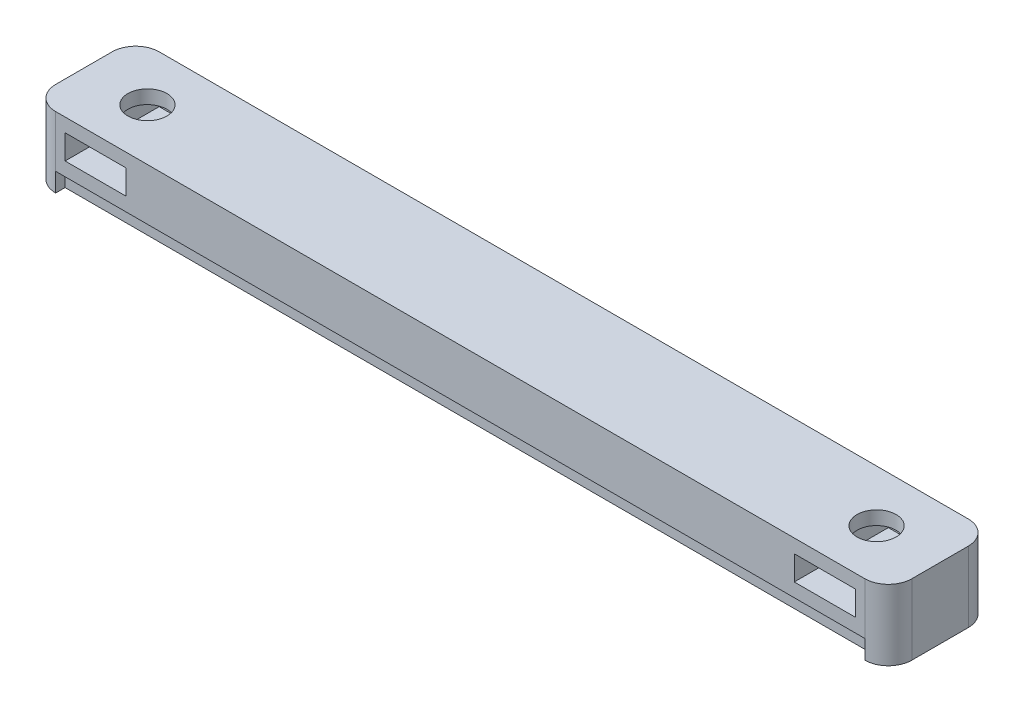
ISO-10303-21;
HEADER;
FILE_DESCRIPTION(('STEP AP214'),'2;1');
FILE_NAME('part.step','',(''),(''),'','','');
FILE_SCHEMA(('AUTOMOTIVE_DESIGN { 1 0 10303 214 1 1 1 1 }'));
ENDSEC;
DATA;
#1=APPLICATION_CONTEXT('core data for automotive mechanical design processes');
#2=APPLICATION_PROTOCOL_DEFINITION('international standard','automotive_design',2000,#1);
#3=PRODUCT_CONTEXT('',#1,'mechanical');
#4=PRODUCT('Part','Part','',(#3));
#5=PRODUCT_RELATED_PRODUCT_CATEGORY('part','',(#4));
#6=PRODUCT_DEFINITION_FORMATION('','',#4);
#7=PRODUCT_DEFINITION_CONTEXT('part definition',#1,'design');
#8=PRODUCT_DEFINITION('design','',#6,#7);
#9=PRODUCT_DEFINITION_SHAPE('','',#8);
#10=(LENGTH_UNIT() NAMED_UNIT(*) SI_UNIT(.MILLI.,.METRE.));
#11=(NAMED_UNIT(*) PLANE_ANGLE_UNIT() SI_UNIT($,.RADIAN.));
#12=(NAMED_UNIT(*) SI_UNIT($,.STERADIAN.) SOLID_ANGLE_UNIT());
#13=UNCERTAINTY_MEASURE_WITH_UNIT(LENGTH_MEASURE(1.E-05),#10,'distance_accuracy_value','');
#14=(GEOMETRIC_REPRESENTATION_CONTEXT(3) GLOBAL_UNCERTAINTY_ASSIGNED_CONTEXT((#13)) GLOBAL_UNIT_ASSIGNED_CONTEXT((#10,
#11,#12)) REPRESENTATION_CONTEXT('',''));
#15=CARTESIAN_POINT('',(0.,0.,0.));
#16=DIRECTION('',(0.,0.,1.));
#17=DIRECTION('',(1.,0.,0.));
#18=AXIS2_PLACEMENT_3D('',#15,#16,#17);
#19=CARTESIAN_POINT('',(0.,-32.,99.5));
#20=DIRECTION('',(0.,0.,-1.));
#21=DIRECTION('',(-1.,0.,0.));
#22=AXIS2_PLACEMENT_3D('',#19,#20,#21);
#23=PLANE('',#22);
#24=DIRECTION('',(0.,-1.,0.));
#25=VECTOR('',#24,1.);
#26=CARTESIAN_POINT('',(84.,-22.5,99.5));
#27=LINE('',#26,#25);
#28=CARTESIAN_POINT('',(84.,-19.9,99.5));
#29=VERTEX_POINT('',#28);
#30=CARTESIAN_POINT('',(84.,-25.1,99.5));
#31=VERTEX_POINT('',#30);
#32=EDGE_CURVE('E264',#29,#31,#27,.T.);
#33=ORIENTED_EDGE('',*,*,#32,.T.);
#34=DIRECTION('',(-1.,0.,0.));
#35=VECTOR('',#34,1.);
#36=CARTESIAN_POINT('',(77.5,-25.1,99.5));
#37=LINE('',#36,#35);
#38=CARTESIAN_POINT('',(71.,-25.1,99.5));
#39=VERTEX_POINT('',#38);
#40=EDGE_CURVE('E251',#31,#39,#37,.T.);
#41=ORIENTED_EDGE('',*,*,#40,.T.);
#42=DIRECTION('',(0.,-1.,0.));
#43=VECTOR('',#42,1.);
#44=CARTESIAN_POINT('',(71.,-22.5,99.5));
#45=LINE('',#44,#43);
#46=CARTESIAN_POINT('',(71.,-19.9,99.5));
#47=VERTEX_POINT('',#46);
#48=EDGE_CURVE('E51',#47,#39,#45,.T.);
#49=ORIENTED_EDGE('',*,*,#48,.F.);
#50=DIRECTION('',(-1.,0.,0.));
#51=VECTOR('',#50,1.);
#52=CARTESIAN_POINT('',(77.5,-19.9,99.5));
#53=LINE('',#52,#51);
#54=EDGE_CURVE('E268',#29,#47,#53,.T.);
#55=ORIENTED_EDGE('',*,*,#54,.F.);
#56=EDGE_LOOP('',(#33,#41,#49,#55));
#57=FACE_BOUND('',#56,.T.);
#58=DIRECTION('',(-1.,0.,0.));
#59=VECTOR('',#58,1.);
#60=CARTESIAN_POINT('',(0.,-28.,99.5));
#61=LINE('',#60,#59);
#62=CARTESIAN_POINT('',(86.,-28.,99.5));
#63=VERTEX_POINT('',#62);
#64=CARTESIAN_POINT('',(-86.,-28.,99.5));
#65=VERTEX_POINT('',#64);
#66=EDGE_CURVE('E287',#63,#65,#61,.T.);
#67=ORIENTED_EDGE('',*,*,#66,.F.);
#68=DIRECTION('',(0.,1.,0.));
#69=VECTOR('',#68,1.);
#70=CARTESIAN_POINT('',(86.,-17.,99.5));
#71=LINE('',#70,#69);
#72=CARTESIAN_POINT('',(86.,-17.,99.5));
#73=VERTEX_POINT('',#72);
#74=EDGE_CURVE('E366',#63,#73,#71,.T.);
#75=ORIENTED_EDGE('',*,*,#74,.T.);
#76=DIRECTION('',(-1.,0.,0.));
#77=VECTOR('',#76,1.);
#78=CARTESIAN_POINT('',(0.,-17.,99.5));
#79=LINE('',#78,#77);
#80=CARTESIAN_POINT('',(-86.,-17.,99.5));
#81=VERTEX_POINT('',#80);
#82=EDGE_CURVE('E334',#73,#81,#79,.T.);
#83=ORIENTED_EDGE('',*,*,#82,.T.);
#84=DIRECTION('',(0.,1.,0.));
#85=VECTOR('',#84,1.);
#86=CARTESIAN_POINT('',(-86.,-32.,99.5));
#87=LINE('',#86,#85);
#88=EDGE_CURVE('E348',#81,#65,#87,.F.);
#89=ORIENTED_EDGE('',*,*,#88,.T.);
#90=EDGE_LOOP('',(#67,#75,#83,#89));
#91=FACE_BOUND('',#90,.T.);
#92=DIRECTION('',(0.,-1.,0.));
#93=VECTOR('',#92,1.);
#94=CARTESIAN_POINT('',(-71.,-22.5,99.5));
#95=LINE('',#94,#93);
#96=CARTESIAN_POINT('',(-71.,-19.9,99.5));
#97=VERTEX_POINT('',#96);
#98=CARTESIAN_POINT('',(-71.,-25.1,99.5));
#99=VERTEX_POINT('',#98);
#100=EDGE_CURVE('E214',#97,#99,#95,.T.);
#101=ORIENTED_EDGE('',*,*,#100,.T.);
#102=DIRECTION('',(-1.,0.,0.));
#103=VECTOR('',#102,1.);
#104=CARTESIAN_POINT('',(-77.5,-25.1,99.5));
#105=LINE('',#104,#103);
#106=CARTESIAN_POINT('',(-84.,-25.1,99.5));
#107=VERTEX_POINT('',#106);
#108=EDGE_CURVE('E197',#99,#107,#105,.T.);
#109=ORIENTED_EDGE('',*,*,#108,.T.);
#110=DIRECTION('',(0.,-1.,0.));
#111=VECTOR('',#110,1.);
#112=CARTESIAN_POINT('',(-84.,-22.5,99.5));
#113=LINE('',#112,#111);
#114=CARTESIAN_POINT('',(-84.,-19.9,99.5));
#115=VERTEX_POINT('',#114);
#116=EDGE_CURVE('E39',#115,#107,#113,.T.);
#117=ORIENTED_EDGE('',*,*,#116,.F.);
#118=DIRECTION('',(-1.,0.,0.));
#119=VECTOR('',#118,1.);
#120=CARTESIAN_POINT('',(-77.5,-19.9,99.5));
#121=LINE('',#120,#119);
#122=EDGE_CURVE('E233',#97,#115,#121,.T.);
#123=ORIENTED_EDGE('',*,*,#122,.F.);
#124=EDGE_LOOP('',(#101,#109,#117,#123));
#125=FACE_BOUND('',#124,.T.);
#126=ADVANCED_FACE('F16',(#57,#91,#125),#23,.F.);
#127=CARTESIAN_POINT('',(77.5,-110.002,88.5));
#128=DIRECTION('',(0.,1.,0.));
#129=DIRECTION('',(0.,0.,1.));
#130=AXIS2_PLACEMENT_3D('',#127,#128,#129);
#131=CYLINDRICAL_SURFACE('',#130,4.15);
#132=CARTESIAN_POINT('',(77.5,-32.,88.5));
#133=DIRECTION('',(0.,1.,0.));
#134=DIRECTION('',(0.,0.,1.));
#135=AXIS2_PLACEMENT_3D('',#132,#133,#134);
#136=CIRCLE('',#135,4.15);
#137=CARTESIAN_POINT('',(77.5,-32.,92.65));
#138=VERTEX_POINT('',#137);
#139=EDGE_CURVE('E325',#138,#138,#136,.T.);
#140=ORIENTED_EDGE('',*,*,#139,.F.);
#141=EDGE_LOOP('',(#140));
#142=FACE_BOUND('',#141,.T.);
#143=CARTESIAN_POINT('',(77.5,-25.1,88.5));
#144=DIRECTION('',(0.,1.,0.));
#145=DIRECTION('',(0.,0.,1.));
#146=AXIS2_PLACEMENT_3D('',#143,#144,#145);
#147=CIRCLE('',#146,4.15);
#148=CARTESIAN_POINT('',(77.5,-25.1,92.65));
#149=VERTEX_POINT('',#148);
#150=EDGE_CURVE('E424',#149,#149,#147,.F.);
#151=ORIENTED_EDGE('',*,*,#150,.F.);
#152=EDGE_LOOP('',(#151));
#153=FACE_BOUND('',#152,.T.);
#154=ADVANCED_FACE('F457',(#142,#153),#131,.F.);
#155=CARTESIAN_POINT('',(-77.5,-110.002,88.5));
#156=DIRECTION('',(0.,1.,0.));
#157=DIRECTION('',(0.,0.,1.));
#158=AXIS2_PLACEMENT_3D('',#155,#156,#157);
#159=CYLINDRICAL_SURFACE('',#158,4.15);
#160=CARTESIAN_POINT('',(-77.5,-32.,88.5));
#161=DIRECTION('',(0.,1.,0.));
#162=DIRECTION('',(0.,0.,1.));
#163=AXIS2_PLACEMENT_3D('',#160,#161,#162);
#164=CIRCLE('',#163,4.15);
#165=CARTESIAN_POINT('',(-77.5,-32.,92.65));
#166=VERTEX_POINT('',#165);
#167=EDGE_CURVE('E330',#166,#166,#164,.T.);
#168=ORIENTED_EDGE('',*,*,#167,.F.);
#169=EDGE_LOOP('',(#168));
#170=FACE_BOUND('',#169,.T.);
#171=CARTESIAN_POINT('',(-77.5,-25.1,88.5));
#172=DIRECTION('',(0.,1.,0.));
#173=DIRECTION('',(0.,0.,1.));
#174=AXIS2_PLACEMENT_3D('',#171,#172,#173);
#175=CIRCLE('',#174,4.15);
#176=CARTESIAN_POINT('',(-77.5,-25.1,92.65));
#177=VERTEX_POINT('',#176);
#178=EDGE_CURVE('E240',#177,#177,#175,.F.);
#179=ORIENTED_EDGE('',*,*,#178,.F.);
#180=EDGE_LOOP('',(#179));
#181=FACE_BOUND('',#180,.T.);
#182=ADVANCED_FACE('F462',(#170,#181),#159,.F.);
#183=CARTESIAN_POINT('',(0.,-32.,88.5));
#184=DIRECTION('',(0.,1.,0.));
#185=DIRECTION('',(-1.,0.,0.));
#186=AXIS2_PLACEMENT_3D('',#183,#184,#185);
#187=PLANE('',#186);
#188=ORIENTED_EDGE('',*,*,#139,.T.);
#189=EDGE_LOOP('',(#188));
#190=FACE_BOUND('',#189,.T.);
#191=ORIENTED_EDGE('',*,*,#167,.T.);
#192=EDGE_LOOP('',(#191));
#193=FACE_BOUND('',#192,.T.);
#194=DIRECTION('',(0.,0.,-1.));
#195=VECTOR('',#194,1.);
#196=CARTESIAN_POINT('',(-86.,-32.,98.5));
#197=LINE('',#196,#195);
#198=CARTESIAN_POINT('',(-86.,-32.,99.5));
#199=VERTEX_POINT('',#198);
#200=CARTESIAN_POINT('',(-86.,-32.,97.5));
#201=VERTEX_POINT('',#200);
#202=EDGE_CURVE('E305',#199,#201,#197,.T.);
#203=ORIENTED_EDGE('',*,*,#202,.F.);
#204=CARTESIAN_POINT('',(-86.,-32.,94.5));
#205=DIRECTION('',(0.,1.,0.));
#206=DIRECTION('',(0.,0.,1.));
#207=AXIS2_PLACEMENT_3D('',#204,#205,#206);
#208=CIRCLE('',#207,5.);
#209=CARTESIAN_POINT('',(-91.,-32.,94.5));
#210=VERTEX_POINT('',#209);
#211=EDGE_CURVE('E389',#199,#210,#208,.F.);
#212=ORIENTED_EDGE('',*,*,#211,.T.);
#213=DIRECTION('',(0.,0.,-1.));
#214=VECTOR('',#213,1.);
#215=CARTESIAN_POINT('',(-91.,-32.,88.5));
#216=LINE('',#215,#214);
#217=CARTESIAN_POINT('',(-91.,-32.,82.5));
#218=VERTEX_POINT('',#217);
#219=EDGE_CURVE('E344',#210,#218,#216,.T.);
#220=ORIENTED_EDGE('',*,*,#219,.T.);
#221=CARTESIAN_POINT('',(-86.,-32.,82.5));
#222=DIRECTION('',(0.,1.,0.));
#223=DIRECTION('',(0.,0.,1.));
#224=AXIS2_PLACEMENT_3D('',#221,#222,#223);
#225=CIRCLE('',#224,5.);
#226=CARTESIAN_POINT('',(-86.,-32.,77.5));
#227=VERTEX_POINT('',#226);
#228=EDGE_CURVE('E392',#218,#227,#225,.F.);
#229=ORIENTED_EDGE('',*,*,#228,.T.);
#230=DIRECTION('',(-1.,0.,0.));
#231=VECTOR('',#230,1.);
#232=CARTESIAN_POINT('',(0.,-32.,77.5));
#233=LINE('',#232,#231);
#234=CARTESIAN_POINT('',(86.,-32.,77.5));
#235=VERTEX_POINT('',#234);
#236=EDGE_CURVE('E339',#235,#227,#233,.T.);
#237=ORIENTED_EDGE('',*,*,#236,.F.);
#238=CARTESIAN_POINT('',(86.,-32.,82.5));
#239=DIRECTION('',(0.,1.,0.));
#240=DIRECTION('',(0.,0.,1.));
#241=AXIS2_PLACEMENT_3D('',#238,#239,#240);
#242=CIRCLE('',#241,5.);
#243=CARTESIAN_POINT('',(91.,-32.,82.5));
#244=VERTEX_POINT('',#243);
#245=EDGE_CURVE('E395',#235,#244,#242,.F.);
#246=ORIENTED_EDGE('',*,*,#245,.T.);
#247=DIRECTION('',(0.,0.,-1.));
#248=VECTOR('',#247,1.);
#249=CARTESIAN_POINT('',(91.,-32.,88.5));
#250=LINE('',#249,#248);
#251=CARTESIAN_POINT('',(91.,-32.,94.5));
#252=VERTEX_POINT('',#251);
#253=EDGE_CURVE('E335',#252,#244,#250,.T.);
#254=ORIENTED_EDGE('',*,*,#253,.F.);
#255=CARTESIAN_POINT('',(86.,-32.,94.5));
#256=DIRECTION('',(0.,1.,0.));
#257=DIRECTION('',(0.,0.,1.));
#258=AXIS2_PLACEMENT_3D('',#255,#256,#257);
#259=CIRCLE('',#258,5.);
#260=CARTESIAN_POINT('',(86.,-32.,99.5));
#261=VERTEX_POINT('',#260);
#262=EDGE_CURVE('E398',#252,#261,#259,.F.);
#263=ORIENTED_EDGE('',*,*,#262,.T.);
#264=DIRECTION('',(0.,0.,-1.));
#265=VECTOR('',#264,1.);
#266=CARTESIAN_POINT('',(86.,-32.,98.5));
#267=LINE('',#266,#265);
#268=CARTESIAN_POINT('',(86.,-32.,97.5));
#269=VERTEX_POINT('',#268);
#270=EDGE_CURVE('E292',#261,#269,#267,.T.);
#271=ORIENTED_EDGE('',*,*,#270,.T.);
#272=DIRECTION('',(-1.,0.,0.));
#273=VECTOR('',#272,1.);
#274=CARTESIAN_POINT('',(0.,-32.,97.5));
#275=LINE('',#274,#273);
#276=EDGE_CURVE('E308',#269,#201,#275,.T.);
#277=ORIENTED_EDGE('',*,*,#276,.T.);
#278=EDGE_LOOP('',(#203,#212,#220,#229,#237,#246,#254,#263,#271,#277));
#279=FACE_BOUND('',#278,.T.);
#280=ADVANCED_FACE('F491',(#190,#193,#279),#187,.F.);
#281=CARTESIAN_POINT('',(91.,-32.,88.5));
#282=DIRECTION('',(1.,0.,0.));
#283=DIRECTION('',(0.,0.,-1.));
#284=AXIS2_PLACEMENT_3D('',#281,#282,#283);
#285=PLANE('',#284);
#286=DIRECTION('',(0.,0.,-1.));
#287=VECTOR('',#286,1.);
#288=CARTESIAN_POINT('',(91.,-17.,88.5));
#289=LINE('',#288,#287);
#290=CARTESIAN_POINT('',(91.,-17.,94.5));
#291=VERTEX_POINT('',#290);
#292=CARTESIAN_POINT('',(91.,-17.,82.5));
#293=VERTEX_POINT('',#292);
#294=EDGE_CURVE('E352',#291,#293,#289,.T.);
#295=ORIENTED_EDGE('',*,*,#294,.F.);
#296=DIRECTION('',(0.,1.,0.));
#297=VECTOR('',#296,1.);
#298=CARTESIAN_POINT('',(91.,-32.,94.5));
#299=LINE('',#298,#297);
#300=EDGE_CURVE('E386',#291,#252,#299,.F.);
#301=ORIENTED_EDGE('',*,*,#300,.T.);
#302=ORIENTED_EDGE('',*,*,#253,.T.);
#303=DIRECTION('',(0.,1.,0.));
#304=VECTOR('',#303,1.);
#305=CARTESIAN_POINT('',(91.,-32.,82.5));
#306=LINE('',#305,#304);
#307=EDGE_CURVE('E382',#244,#293,#306,.T.);
#308=ORIENTED_EDGE('',*,*,#307,.T.);
#309=EDGE_LOOP('',(#295,#301,#302,#308));
#310=FACE_BOUND('',#309,.T.);
#311=ADVANCED_FACE('F468',(#310),#285,.T.);
#312=CARTESIAN_POINT('',(0.,-32.,77.5));
#313=DIRECTION('',(0.,0.,-1.));
#314=DIRECTION('',(-1.,0.,0.));
#315=AXIS2_PLACEMENT_3D('',#312,#313,#314);
#316=PLANE('',#315);
#317=DIRECTION('',(-1.,0.,0.));
#318=VECTOR('',#317,1.);
#319=CARTESIAN_POINT('',(0.,-17.,77.5));
#320=LINE('',#319,#318);
#321=CARTESIAN_POINT('',(86.,-17.,77.5));
#322=VERTEX_POINT('',#321);
#323=CARTESIAN_POINT('',(-86.,-17.,77.5));
#324=VERTEX_POINT('',#323);
#325=EDGE_CURVE('E356',#322,#324,#320,.T.);
#326=ORIENTED_EDGE('',*,*,#325,.F.);
#327=DIRECTION('',(0.,1.,0.));
#328=VECTOR('',#327,1.);
#329=CARTESIAN_POINT('',(86.,-32.,77.5));
#330=LINE('',#329,#328);
#331=EDGE_CURVE('E406',#322,#235,#330,.F.);
#332=ORIENTED_EDGE('',*,*,#331,.T.);
#333=ORIENTED_EDGE('',*,*,#236,.T.);
#334=DIRECTION('',(0.,1.,0.));
#335=VECTOR('',#334,1.);
#336=CARTESIAN_POINT('',(-86.,-17.,77.5));
#337=LINE('',#336,#335);
#338=EDGE_CURVE('E402',#227,#324,#337,.T.);
#339=ORIENTED_EDGE('',*,*,#338,.T.);
#340=EDGE_LOOP('',(#326,#332,#333,#339));
#341=FACE_BOUND('',#340,.T.);
#342=ADVANCED_FACE('F496',(#341),#316,.T.);
#343=CARTESIAN_POINT('',(-91.,-32.,88.5));
#344=DIRECTION('',(1.,0.,0.));
#345=DIRECTION('',(0.,0.,-1.));
#346=AXIS2_PLACEMENT_3D('',#343,#344,#345);
#347=PLANE('',#346);
#348=DIRECTION('',(0.,0.,-1.));
#349=VECTOR('',#348,1.);
#350=CARTESIAN_POINT('',(-91.,-17.,88.5));
#351=LINE('',#350,#349);
#352=CARTESIAN_POINT('',(-91.,-17.,94.5));
#353=VERTEX_POINT('',#352);
#354=CARTESIAN_POINT('',(-91.,-17.,82.5));
#355=VERTEX_POINT('',#354);
#356=EDGE_CURVE('E340',#353,#355,#351,.T.);
#357=ORIENTED_EDGE('',*,*,#356,.T.);
#358=DIRECTION('',(0.,1.,0.));
#359=VECTOR('',#358,1.);
#360=CARTESIAN_POINT('',(-91.,-32.,82.5));
#361=LINE('',#360,#359);
#362=EDGE_CURVE('E10',#355,#218,#361,.F.);
#363=ORIENTED_EDGE('',*,*,#362,.T.);
#364=ORIENTED_EDGE('',*,*,#219,.F.);
#365=DIRECTION('',(0.,1.,0.));
#366=VECTOR('',#365,1.);
#367=CARTESIAN_POINT('',(-91.,-32.,94.5));
#368=LINE('',#367,#366);
#369=EDGE_CURVE('E26',#210,#353,#368,.T.);
#370=ORIENTED_EDGE('',*,*,#369,.T.);
#371=EDGE_LOOP('',(#357,#363,#364,#370));
#372=FACE_BOUND('',#371,.T.);
#373=ADVANCED_FACE('F528',(#372),#347,.F.);
#374=CARTESIAN_POINT('',(0.,-17.,88.5));
#375=DIRECTION('',(0.,1.,0.));
#376=DIRECTION('',(-1.,0.,0.));
#377=AXIS2_PLACEMENT_3D('',#374,#375,#376);
#378=PLANE('',#377);
#379=CARTESIAN_POINT('',(-77.5,-17.,88.5));
#380=DIRECTION('',(0.,1.,0.));
#381=DIRECTION('',(0.,0.,1.));
#382=AXIS2_PLACEMENT_3D('',#379,#380,#381);
#383=CIRCLE('',#382,4.15);
#384=CARTESIAN_POINT('',(-77.5,-17.,92.65));
#385=VERTEX_POINT('',#384);
#386=EDGE_CURVE('E329',#385,#385,#383,.T.);
#387=ORIENTED_EDGE('',*,*,#386,.F.);
#388=EDGE_LOOP('',(#387));
#389=FACE_BOUND('',#388,.T.);
#390=CARTESIAN_POINT('',(77.5,-17.,88.5));
#391=DIRECTION('',(0.,1.,0.));
#392=DIRECTION('',(0.,0.,1.));
#393=AXIS2_PLACEMENT_3D('',#390,#391,#392);
#394=CIRCLE('',#393,4.15);
#395=CARTESIAN_POINT('',(77.5,-17.,92.65));
#396=VERTEX_POINT('',#395);
#397=EDGE_CURVE('E324',#396,#396,#394,.T.);
#398=ORIENTED_EDGE('',*,*,#397,.F.);
#399=EDGE_LOOP('',(#398));
#400=FACE_BOUND('',#399,.T.);
#401=ORIENTED_EDGE('',*,*,#82,.F.);
#402=CARTESIAN_POINT('',(86.,-17.,94.5));
#403=DIRECTION('',(0.,1.,0.));
#404=DIRECTION('',(0.,0.,1.));
#405=AXIS2_PLACEMENT_3D('',#402,#403,#404);
#406=CIRCLE('',#405,5.);
#407=EDGE_CURVE('E379',#73,#291,#406,.T.);
#408=ORIENTED_EDGE('',*,*,#407,.T.);
#409=ORIENTED_EDGE('',*,*,#294,.T.);
#410=CARTESIAN_POINT('',(86.,-17.,82.5));
#411=DIRECTION('',(0.,1.,0.));
#412=DIRECTION('',(0.,0.,1.));
#413=AXIS2_PLACEMENT_3D('',#410,#411,#412);
#414=CIRCLE('',#413,5.);
#415=EDGE_CURVE('E376',#293,#322,#414,.T.);
#416=ORIENTED_EDGE('',*,*,#415,.T.);
#417=ORIENTED_EDGE('',*,*,#325,.T.);
#418=CARTESIAN_POINT('',(-86.,-17.,82.5));
#419=DIRECTION('',(0.,1.,0.));
#420=DIRECTION('',(0.,0.,1.));
#421=AXIS2_PLACEMENT_3D('',#418,#419,#420);
#422=CIRCLE('',#421,5.);
#423=EDGE_CURVE('E373',#324,#355,#422,.T.);
#424=ORIENTED_EDGE('',*,*,#423,.T.);
#425=ORIENTED_EDGE('',*,*,#356,.F.);
#426=CARTESIAN_POINT('',(-86.,-17.,94.5));
#427=DIRECTION('',(0.,1.,0.));
#428=DIRECTION('',(0.,0.,1.));
#429=AXIS2_PLACEMENT_3D('',#426,#427,#428);
#430=CIRCLE('',#429,5.);
#431=EDGE_CURVE('E370',#353,#81,#430,.T.);
#432=ORIENTED_EDGE('',*,*,#431,.T.);
#433=EDGE_LOOP('',(#401,#408,#409,#416,#417,#424,#425,#432));
#434=FACE_BOUND('',#433,.T.);
#435=ADVANCED_FACE('F474',(#389,#400,#434),#378,.T.);
#436=CARTESIAN_POINT('',(86.,-32.,94.5));
#437=DIRECTION('',(0.,-1.,0.));
#438=DIRECTION('',(0.,0.,-1.));
#439=AXIS2_PLACEMENT_3D('',#436,#437,#438);
#440=CYLINDRICAL_SURFACE('',#439,5.);
#441=ORIENTED_EDGE('',*,*,#262,.F.);
#442=ORIENTED_EDGE('',*,*,#300,.F.);
#443=ORIENTED_EDGE('',*,*,#407,.F.);
#444=ORIENTED_EDGE('',*,*,#74,.F.);
#445=EDGE_CURVE('E367',#261,#63,#71,.T.);
#446=ORIENTED_EDGE('',*,*,#445,.F.);
#447=EDGE_LOOP('',(#441,#442,#443,#444,#446));
#448=FACE_BOUND('',#447,.T.);
#449=ADVANCED_FACE('F470',(#448),#440,.T.);
#450=CARTESIAN_POINT('',(86.,-32.,82.5));
#451=DIRECTION('',(0.,1.,0.));
#452=DIRECTION('',(0.,0.,1.));
#453=AXIS2_PLACEMENT_3D('',#450,#451,#452);
#454=CYLINDRICAL_SURFACE('',#453,5.);
#455=ORIENTED_EDGE('',*,*,#245,.F.);
#456=ORIENTED_EDGE('',*,*,#331,.F.);
#457=ORIENTED_EDGE('',*,*,#415,.F.);
#458=ORIENTED_EDGE('',*,*,#307,.F.);
#459=EDGE_LOOP('',(#455,#456,#457,#458));
#460=FACE_BOUND('',#459,.T.);
#461=ADVANCED_FACE('F473',(#460),#454,.T.);
#462=CARTESIAN_POINT('',(-86.,-32.,82.5));
#463=DIRECTION('',(0.,-1.,0.));
#464=DIRECTION('',(0.,0.,-1.));
#465=AXIS2_PLACEMENT_3D('',#462,#463,#464);
#466=CYLINDRICAL_SURFACE('',#465,5.);
#467=ORIENTED_EDGE('',*,*,#228,.F.);
#468=ORIENTED_EDGE('',*,*,#362,.F.);
#469=ORIENTED_EDGE('',*,*,#423,.F.);
#470=ORIENTED_EDGE('',*,*,#338,.F.);
#471=EDGE_LOOP('',(#467,#468,#469,#470));
#472=FACE_BOUND('',#471,.T.);
#473=ADVANCED_FACE('F477',(#472),#466,.T.);
#474=CARTESIAN_POINT('',(-86.,-32.,94.5));
#475=DIRECTION('',(0.,1.,0.));
#476=DIRECTION('',(0.,0.,1.));
#477=AXIS2_PLACEMENT_3D('',#474,#475,#476);
#478=CYLINDRICAL_SURFACE('',#477,5.);
#479=ORIENTED_EDGE('',*,*,#211,.F.);
#480=DIRECTION('',(0.,-1.,0.));
#481=VECTOR('',#480,1.);
#482=CARTESIAN_POINT('',(-86.,-28.,99.5));
#483=LINE('',#482,#481);
#484=EDGE_CURVE('E321',#65,#199,#483,.T.);
#485=ORIENTED_EDGE('',*,*,#484,.F.);
#486=ORIENTED_EDGE('',*,*,#88,.F.);
#487=ORIENTED_EDGE('',*,*,#431,.F.);
#488=ORIENTED_EDGE('',*,*,#369,.F.);
#489=EDGE_LOOP('',(#479,#485,#486,#487,#488));
#490=FACE_BOUND('',#489,.T.);
#491=ADVANCED_FACE('F18',(#490),#478,.T.);
#492=CARTESIAN_POINT('',(77.5,-19.9,88.5));
#493=DIRECTION('',(0.,1.,0.));
#494=DIRECTION('',(0.,0.,1.));
#495=AXIS2_PLACEMENT_3D('',#492,#493,#494);
#496=CIRCLE('',#495,4.15);
#497=CARTESIAN_POINT('',(77.5,-19.9,92.65));
#498=VERTEX_POINT('',#497);
#499=EDGE_CURVE('E20',#498,#498,#496,.F.);
#500=ORIENTED_EDGE('',*,*,#499,.T.);
#501=EDGE_LOOP('',(#500));
#502=FACE_BOUND('',#501,.T.);
#503=ORIENTED_EDGE('',*,*,#397,.T.);
#504=EDGE_LOOP('',(#503));
#505=FACE_BOUND('',#504,.T.);
#506=ADVANCED_FACE('F436',(#502,#505),#131,.F.);
#507=CARTESIAN_POINT('',(-77.5,-19.9,88.5));
#508=DIRECTION('',(0.,1.,0.));
#509=DIRECTION('',(0.,0.,1.));
#510=AXIS2_PLACEMENT_3D('',#507,#508,#509);
#511=CIRCLE('',#510,4.15);
#512=CARTESIAN_POINT('',(-77.5,-19.9,92.65));
#513=VERTEX_POINT('',#512);
#514=EDGE_CURVE('E421',#513,#513,#511,.F.);
#515=ORIENTED_EDGE('',*,*,#514,.T.);
#516=EDGE_LOOP('',(#515));
#517=FACE_BOUND('',#516,.T.);
#518=ORIENTED_EDGE('',*,*,#386,.T.);
#519=EDGE_LOOP('',(#518));
#520=FACE_BOUND('',#519,.T.);
#521=ADVANCED_FACE('F542',(#517,#520),#159,.F.);
#522=CARTESIAN_POINT('',(-86.,-28.,98.5));
#523=DIRECTION('',(-1.,0.,0.));
#524=DIRECTION('',(0.,0.,1.));
#525=AXIS2_PLACEMENT_3D('',#522,#523,#524);
#526=PLANE('',#525);
#527=ORIENTED_EDGE('',*,*,#202,.T.);
#528=DIRECTION('',(0.,-1.,0.));
#529=VECTOR('',#528,1.);
#530=CARTESIAN_POINT('',(-86.,-28.,97.5));
#531=LINE('',#530,#529);
#532=CARTESIAN_POINT('',(-86.,-28.,97.5));
#533=VERTEX_POINT('',#532);
#534=EDGE_CURVE('E317',#533,#201,#531,.T.);
#535=ORIENTED_EDGE('',*,*,#534,.F.);
#536=DIRECTION('',(0.,0.,-1.));
#537=VECTOR('',#536,1.);
#538=CARTESIAN_POINT('',(-86.,-28.,98.5));
#539=LINE('',#538,#537);
#540=EDGE_CURVE('E291',#65,#533,#539,.T.);
#541=ORIENTED_EDGE('',*,*,#540,.F.);
#542=ORIENTED_EDGE('',*,*,#484,.T.);
#543=EDGE_LOOP('',(#527,#535,#541,#542));
#544=FACE_BOUND('',#543,.T.);
#545=ADVANCED_FACE('F516',(#544),#526,.F.);
#546=CARTESIAN_POINT('',(0.,-28.,97.5));
#547=DIRECTION('',(0.,0.,1.));
#548=DIRECTION('',(1.,0.,0.));
#549=AXIS2_PLACEMENT_3D('',#546,#547,#548);
#550=PLANE('',#549);
#551=ORIENTED_EDGE('',*,*,#276,.F.);
#552=DIRECTION('',(0.,-1.,0.));
#553=VECTOR('',#552,1.);
#554=CARTESIAN_POINT('',(86.,-28.,97.5));
#555=LINE('',#554,#553);
#556=CARTESIAN_POINT('',(86.,-28.,97.5));
#557=VERTEX_POINT('',#556);
#558=EDGE_CURVE('E304',#557,#269,#555,.T.);
#559=ORIENTED_EDGE('',*,*,#558,.F.);
#560=DIRECTION('',(-1.,0.,0.));
#561=VECTOR('',#560,1.);
#562=CARTESIAN_POINT('',(0.,-28.,97.5));
#563=LINE('',#562,#561);
#564=EDGE_CURVE('E296',#557,#533,#563,.T.);
#565=ORIENTED_EDGE('',*,*,#564,.T.);
#566=ORIENTED_EDGE('',*,*,#534,.T.);
#567=EDGE_LOOP('',(#551,#559,#565,#566));
#568=FACE_BOUND('',#567,.T.);
#569=ADVANCED_FACE('F514',(#568),#550,.T.);
#570=CARTESIAN_POINT('',(86.,-28.,98.5));
#571=DIRECTION('',(-1.,0.,0.));
#572=DIRECTION('',(0.,0.,1.));
#573=AXIS2_PLACEMENT_3D('',#570,#571,#572);
#574=PLANE('',#573);
#575=ORIENTED_EDGE('',*,*,#270,.F.);
#576=ORIENTED_EDGE('',*,*,#445,.T.);
#577=DIRECTION('',(0.,0.,-1.));
#578=VECTOR('',#577,1.);
#579=CARTESIAN_POINT('',(86.,-28.,98.5));
#580=LINE('',#579,#578);
#581=EDGE_CURVE('E300',#63,#557,#580,.T.);
#582=ORIENTED_EDGE('',*,*,#581,.T.);
#583=ORIENTED_EDGE('',*,*,#558,.T.);
#584=EDGE_LOOP('',(#575,#576,#582,#583));
#585=FACE_BOUND('',#584,.T.);
#586=ADVANCED_FACE('F510',(#585),#574,.T.);
#587=CARTESIAN_POINT('',(0.,-28.,88.5));
#588=DIRECTION('',(0.,-1.,0.));
#589=DIRECTION('',(1.,0.,0.));
#590=AXIS2_PLACEMENT_3D('',#587,#588,#589);
#591=PLANE('',#590);
#592=ORIENTED_EDGE('',*,*,#66,.T.);
#593=ORIENTED_EDGE('',*,*,#540,.T.);
#594=ORIENTED_EDGE('',*,*,#564,.F.);
#595=ORIENTED_EDGE('',*,*,#581,.F.);
#596=EDGE_LOOP('',(#592,#593,#594,#595));
#597=FACE_BOUND('',#596,.T.);
#598=ADVANCED_FACE('F518',(#597),#591,.T.);
#599=CARTESIAN_POINT('',(-77.5,-19.9,79.5));
#600=DIRECTION('',(0.,1.,0.));
#601=DIRECTION('',(0.,0.,1.));
#602=AXIS2_PLACEMENT_3D('',#599,#600,#601);
#603=PLANE('',#602);
#604=ORIENTED_EDGE('',*,*,#122,.T.);
#605=DIRECTION('',(0.,0.,1.));
#606=VECTOR('',#605,1.);
#607=CARTESIAN_POINT('',(-84.,-19.9,79.5));
#608=LINE('',#607,#606);
#609=CARTESIAN_POINT('',(-84.,-19.9,79.5));
#610=VERTEX_POINT('',#609);
#611=EDGE_CURVE('E241',#610,#115,#608,.T.);
#612=ORIENTED_EDGE('',*,*,#611,.F.);
#613=DIRECTION('',(-1.,0.,0.));
#614=VECTOR('',#613,1.);
#615=CARTESIAN_POINT('',(-77.5,-19.9,79.5));
#616=LINE('',#615,#614);
#617=CARTESIAN_POINT('',(-71.,-19.9,79.5));
#618=VERTEX_POINT('',#617);
#619=EDGE_CURVE('E220',#618,#610,#616,.T.);
#620=ORIENTED_EDGE('',*,*,#619,.F.);
#621=DIRECTION('',(0.,0.,1.));
#622=VECTOR('',#621,1.);
#623=CARTESIAN_POINT('',(-71.,-19.9,79.5));
#624=LINE('',#623,#622);
#625=EDGE_CURVE('E217',#618,#97,#624,.T.);
#626=ORIENTED_EDGE('',*,*,#625,.T.);
#627=EDGE_LOOP('',(#604,#612,#620,#626));
#628=FACE_BOUND('',#627,.T.);
#629=ORIENTED_EDGE('',*,*,#514,.F.);
#630=EDGE_LOOP('',(#629));
#631=FACE_BOUND('',#630,.T.);
#632=ADVANCED_FACE('F553',(#628,#631),#603,.F.);
#633=CARTESIAN_POINT('',(-77.5,-25.1,79.5));
#634=DIRECTION('',(0.,1.,0.));
#635=DIRECTION('',(0.,0.,1.));
#636=AXIS2_PLACEMENT_3D('',#633,#634,#635);
#637=PLANE('',#636);
#638=ORIENTED_EDGE('',*,*,#108,.F.);
#639=DIRECTION('',(0.,0.,1.));
#640=VECTOR('',#639,1.);
#641=CARTESIAN_POINT('',(-71.,-25.1,79.5));
#642=LINE('',#641,#640);
#643=CARTESIAN_POINT('',(-71.,-25.1,79.5));
#644=VERTEX_POINT('',#643);
#645=EDGE_CURVE('E191',#644,#99,#642,.T.);
#646=ORIENTED_EDGE('',*,*,#645,.F.);
#647=DIRECTION('',(-1.,0.,0.));
#648=VECTOR('',#647,1.);
#649=CARTESIAN_POINT('',(-77.5,-25.1,79.5));
#650=LINE('',#649,#648);
#651=CARTESIAN_POINT('',(-84.,-25.1,79.5));
#652=VERTEX_POINT('',#651);
#653=EDGE_CURVE('E195',#644,#652,#650,.T.);
#654=ORIENTED_EDGE('',*,*,#653,.T.);
#655=DIRECTION('',(0.,0.,1.));
#656=VECTOR('',#655,1.);
#657=CARTESIAN_POINT('',(-84.,-25.1,79.5));
#658=LINE('',#657,#656);
#659=EDGE_CURVE('E203',#652,#107,#658,.T.);
#660=ORIENTED_EDGE('',*,*,#659,.T.);
#661=EDGE_LOOP('',(#638,#646,#654,#660));
#662=FACE_BOUND('',#661,.T.);
#663=ORIENTED_EDGE('',*,*,#178,.T.);
#664=EDGE_LOOP('',(#663));
#665=FACE_BOUND('',#664,.T.);
#666=ADVANCED_FACE('F193',(#662,#665),#637,.T.);
#667=CARTESIAN_POINT('',(-71.,-22.5,79.5));
#668=DIRECTION('',(-1.,0.,0.));
#669=DIRECTION('',(0.,0.,1.));
#670=AXIS2_PLACEMENT_3D('',#667,#668,#669);
#671=PLANE('',#670);
#672=ORIENTED_EDGE('',*,*,#100,.F.);
#673=ORIENTED_EDGE('',*,*,#625,.F.);
#674=DIRECTION('',(0.,-1.,0.));
#675=VECTOR('',#674,1.);
#676=CARTESIAN_POINT('',(-71.,-22.5,79.5));
#677=LINE('',#676,#675);
#678=EDGE_CURVE('E204',#618,#644,#677,.T.);
#679=ORIENTED_EDGE('',*,*,#678,.T.);
#680=ORIENTED_EDGE('',*,*,#645,.T.);
#681=EDGE_LOOP('',(#672,#673,#679,#680));
#682=FACE_BOUND('',#681,.T.);
#683=ADVANCED_FACE('F216',(#682),#671,.T.);
#684=CARTESIAN_POINT('',(-84.,-22.5,79.5));
#685=DIRECTION('',(-1.,0.,0.));
#686=DIRECTION('',(0.,0.,1.));
#687=AXIS2_PLACEMENT_3D('',#684,#685,#686);
#688=PLANE('',#687);
#689=ORIENTED_EDGE('',*,*,#116,.T.);
#690=ORIENTED_EDGE('',*,*,#659,.F.);
#691=DIRECTION('',(0.,-1.,0.));
#692=VECTOR('',#691,1.);
#693=CARTESIAN_POINT('',(-84.,-22.5,79.5));
#694=LINE('',#693,#692);
#695=EDGE_CURVE('E212',#610,#652,#694,.T.);
#696=ORIENTED_EDGE('',*,*,#695,.F.);
#697=ORIENTED_EDGE('',*,*,#611,.T.);
#698=EDGE_LOOP('',(#689,#690,#696,#697));
#699=FACE_BOUND('',#698,.T.);
#700=ADVANCED_FACE('F452',(#699),#688,.F.);
#701=CARTESIAN_POINT('',(0.,-22.5,79.5));
#702=DIRECTION('',(0.,0.,1.));
#703=DIRECTION('',(1.,0.,0.));
#704=AXIS2_PLACEMENT_3D('',#701,#702,#703);
#705=PLANE('',#704);
#706=ORIENTED_EDGE('',*,*,#678,.F.);
#707=ORIENTED_EDGE('',*,*,#619,.T.);
#708=ORIENTED_EDGE('',*,*,#695,.T.);
#709=ORIENTED_EDGE('',*,*,#653,.F.);
#710=EDGE_LOOP('',(#706,#707,#708,#709));
#711=FACE_BOUND('',#710,.T.);
#712=ADVANCED_FACE('F209',(#711),#705,.T.);
#713=CARTESIAN_POINT('',(77.5,-19.9,79.5));
#714=DIRECTION('',(0.,1.,0.));
#715=DIRECTION('',(0.,0.,1.));
#716=AXIS2_PLACEMENT_3D('',#713,#714,#715);
#717=PLANE('',#716);
#718=ORIENTED_EDGE('',*,*,#54,.T.);
#719=DIRECTION('',(0.,0.,1.));
#720=VECTOR('',#719,1.);
#721=CARTESIAN_POINT('',(71.,-19.9,79.5));
#722=LINE('',#721,#720);
#723=CARTESIAN_POINT('',(71.,-19.9,79.5));
#724=VERTEX_POINT('',#723);
#725=EDGE_CURVE('E282',#724,#47,#722,.T.);
#726=ORIENTED_EDGE('',*,*,#725,.F.);
#727=DIRECTION('',(-1.,0.,0.));
#728=VECTOR('',#727,1.);
#729=CARTESIAN_POINT('',(77.5,-19.9,79.5));
#730=LINE('',#729,#728);
#731=CARTESIAN_POINT('',(84.,-19.9,79.5));
#732=VERTEX_POINT('',#731);
#733=EDGE_CURVE('E250',#732,#724,#730,.T.);
#734=ORIENTED_EDGE('',*,*,#733,.F.);
#735=DIRECTION('',(0.,0.,1.));
#736=VECTOR('',#735,1.);
#737=CARTESIAN_POINT('',(84.,-19.9,79.5));
#738=LINE('',#737,#736);
#739=EDGE_CURVE('E231',#732,#29,#738,.T.);
#740=ORIENTED_EDGE('',*,*,#739,.T.);
#741=EDGE_LOOP('',(#718,#726,#734,#740));
#742=FACE_BOUND('',#741,.T.);
#743=ORIENTED_EDGE('',*,*,#499,.F.);
#744=EDGE_LOOP('',(#743));
#745=FACE_BOUND('',#744,.T.);
#746=ADVANCED_FACE('F439',(#742,#745),#717,.F.);
#747=CARTESIAN_POINT('',(77.5,-25.1,79.5));
#748=DIRECTION('',(0.,1.,0.));
#749=DIRECTION('',(0.,0.,1.));
#750=AXIS2_PLACEMENT_3D('',#747,#748,#749);
#751=PLANE('',#750);
#752=ORIENTED_EDGE('',*,*,#40,.F.);
#753=DIRECTION('',(0.,0.,1.));
#754=VECTOR('',#753,1.);
#755=CARTESIAN_POINT('',(84.,-25.1,79.5));
#756=LINE('',#755,#754);
#757=CARTESIAN_POINT('',(84.,-25.1,79.5));
#758=VERTEX_POINT('',#757);
#759=EDGE_CURVE('E263',#758,#31,#756,.T.);
#760=ORIENTED_EDGE('',*,*,#759,.F.);
#761=DIRECTION('',(-1.,0.,0.));
#762=VECTOR('',#761,1.);
#763=CARTESIAN_POINT('',(77.5,-25.1,79.5));
#764=LINE('',#763,#762);
#765=CARTESIAN_POINT('',(71.,-25.1,79.5));
#766=VERTEX_POINT('',#765);
#767=EDGE_CURVE('E259',#758,#766,#764,.T.);
#768=ORIENTED_EDGE('',*,*,#767,.T.);
#769=DIRECTION('',(0.,0.,1.));
#770=VECTOR('',#769,1.);
#771=CARTESIAN_POINT('',(71.,-25.1,79.5));
#772=LINE('',#771,#770);
#773=EDGE_CURVE('E279',#766,#39,#772,.T.);
#774=ORIENTED_EDGE('',*,*,#773,.T.);
#775=EDGE_LOOP('',(#752,#760,#768,#774));
#776=FACE_BOUND('',#775,.T.);
#777=ORIENTED_EDGE('',*,*,#150,.T.);
#778=EDGE_LOOP('',(#777));
#779=FACE_BOUND('',#778,.T.);
#780=ADVANCED_FACE('F441',(#776,#779),#751,.T.);
#781=CARTESIAN_POINT('',(84.,-22.5,79.5));
#782=DIRECTION('',(-1.,0.,0.));
#783=DIRECTION('',(0.,0.,1.));
#784=AXIS2_PLACEMENT_3D('',#781,#782,#783);
#785=PLANE('',#784);
#786=ORIENTED_EDGE('',*,*,#32,.F.);
#787=ORIENTED_EDGE('',*,*,#739,.F.);
#788=DIRECTION('',(0.,-1.,0.));
#789=VECTOR('',#788,1.);
#790=CARTESIAN_POINT('',(84.,-22.5,79.5));
#791=LINE('',#790,#789);
#792=EDGE_CURVE('E246',#732,#758,#791,.T.);
#793=ORIENTED_EDGE('',*,*,#792,.T.);
#794=ORIENTED_EDGE('',*,*,#759,.T.);
#795=EDGE_LOOP('',(#786,#787,#793,#794));
#796=FACE_BOUND('',#795,.T.);
#797=ADVANCED_FACE('F449',(#796),#785,.T.);
#798=CARTESIAN_POINT('',(71.,-22.5,79.5));
#799=DIRECTION('',(-1.,0.,0.));
#800=DIRECTION('',(0.,0.,1.));
#801=AXIS2_PLACEMENT_3D('',#798,#799,#800);
#802=PLANE('',#801);
#803=ORIENTED_EDGE('',*,*,#48,.T.);
#804=ORIENTED_EDGE('',*,*,#773,.F.);
#805=DIRECTION('',(0.,-1.,0.));
#806=VECTOR('',#805,1.);
#807=CARTESIAN_POINT('',(71.,-22.5,79.5));
#808=LINE('',#807,#806);
#809=EDGE_CURVE('E255',#724,#766,#808,.T.);
#810=ORIENTED_EDGE('',*,*,#809,.F.);
#811=ORIENTED_EDGE('',*,*,#725,.T.);
#812=EDGE_LOOP('',(#803,#804,#810,#811));
#813=FACE_BOUND('',#812,.T.);
#814=ADVANCED_FACE('F555',(#813),#802,.F.);
#815=CARTESIAN_POINT('',(0.,-22.5,79.5));
#816=DIRECTION('',(0.,0.,1.));
#817=DIRECTION('',(1.,0.,0.));
#818=AXIS2_PLACEMENT_3D('',#815,#816,#817);
#819=PLANE('',#818);
#820=ORIENTED_EDGE('',*,*,#792,.F.);
#821=ORIENTED_EDGE('',*,*,#733,.T.);
#822=ORIENTED_EDGE('',*,*,#809,.T.);
#823=ORIENTED_EDGE('',*,*,#767,.F.);
#824=EDGE_LOOP('',(#820,#821,#822,#823));
#825=FACE_BOUND('',#824,.T.);
#826=ADVANCED_FACE('F560',(#825),#819,.T.);
#827=CLOSED_SHELL('',(#126,#154,#182,#280,#311,#342,#373,#435,#449,#461,#473,#491,#506,#521,
#545,#569,#586,#598,#632,#666,#683,#700,#712,#746,#780,#797,#814,#826));
#828=MANIFOLD_SOLID_BREP('B1',#827);
#829=ADVANCED_BREP_SHAPE_REPRESENTATION('',(#18,#828),#14);
#830=SHAPE_DEFINITION_REPRESENTATION(#9,#829);
ENDSEC;
END-ISO-10303-21;
